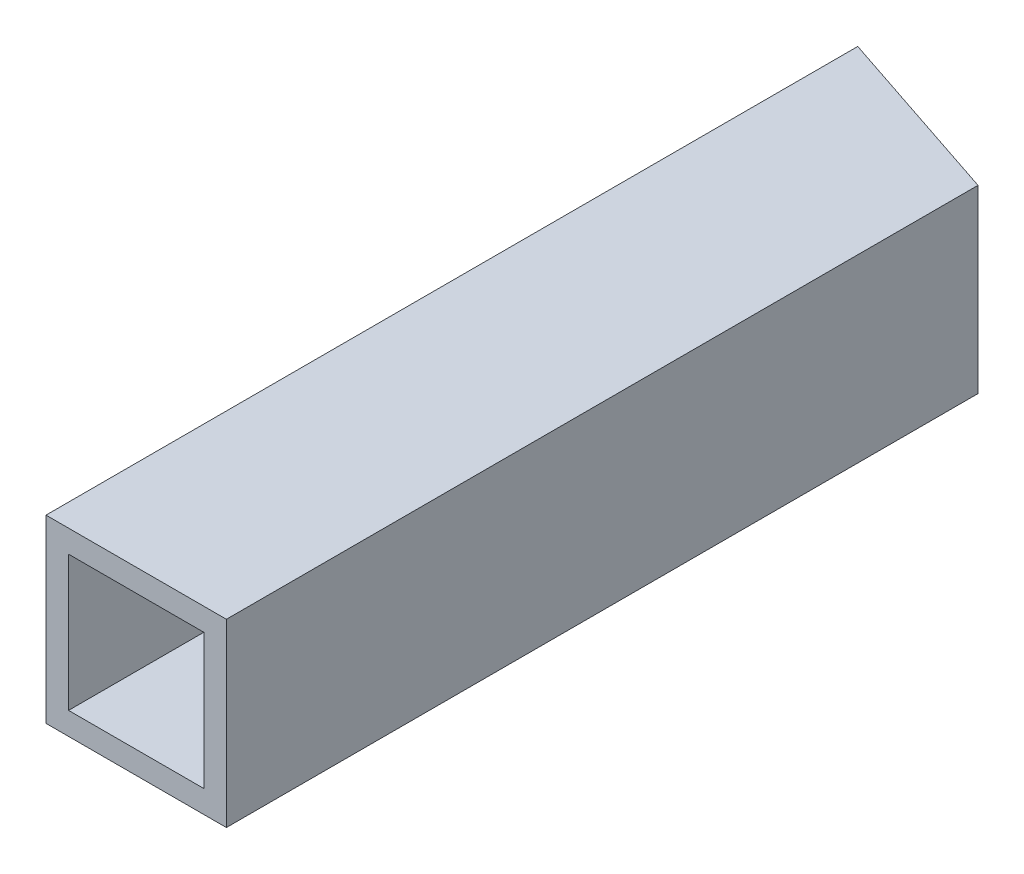
ISO-10303-21;
HEADER;
FILE_DESCRIPTION(('STEP AP214'),'2;1');
FILE_NAME('part.step','',(''),(''),'','','');
FILE_SCHEMA(('AUTOMOTIVE_DESIGN { 1 0 10303 214 1 1 1 1 }'));
ENDSEC;
DATA;
#1=APPLICATION_CONTEXT('core data for automotive mechanical design processes');
#2=APPLICATION_PROTOCOL_DEFINITION('international standard','automotive_design',2000,#1);
#3=PRODUCT_CONTEXT('',#1,'mechanical');
#4=PRODUCT('Part','Part','',(#3));
#5=PRODUCT_RELATED_PRODUCT_CATEGORY('part','',(#4));
#6=PRODUCT_DEFINITION_FORMATION('','',#4);
#7=PRODUCT_DEFINITION_CONTEXT('part definition',#1,'design');
#8=PRODUCT_DEFINITION('design','',#6,#7);
#9=PRODUCT_DEFINITION_SHAPE('','',#8);
#10=(LENGTH_UNIT() NAMED_UNIT(*) SI_UNIT(.MILLI.,.METRE.));
#11=(NAMED_UNIT(*) PLANE_ANGLE_UNIT() SI_UNIT($,.RADIAN.));
#12=(NAMED_UNIT(*) SI_UNIT($,.STERADIAN.) SOLID_ANGLE_UNIT());
#13=UNCERTAINTY_MEASURE_WITH_UNIT(LENGTH_MEASURE(1.E-05),#10,'distance_accuracy_value','');
#14=(GEOMETRIC_REPRESENTATION_CONTEXT(3) GLOBAL_UNCERTAINTY_ASSIGNED_CONTEXT((#13)) GLOBAL_UNIT_ASSIGNED_CONTEXT((#10,
#11,#12)) REPRESENTATION_CONTEXT('',''));
#15=CARTESIAN_POINT('',(0.,0.,0.));
#16=DIRECTION('',(0.,0.,1.));
#17=DIRECTION('',(1.,0.,0.));
#18=AXIS2_PLACEMENT_3D('',#15,#16,#17);
#19=CARTESIAN_POINT('',(0.,0.,114.3));
#20=DIRECTION('',(0.,0.,-1.));
#21=DIRECTION('',(-1.,0.,0.));
#22=AXIS2_PLACEMENT_3D('',#19,#20,#21);
#23=PLANE('',#22);
#24=DIRECTION('',(0.,-1.,0.));
#25=VECTOR('',#24,1.);
#26=CARTESIAN_POINT('',(0.,0.,114.3));
#27=LINE('',#26,#25);
#28=CARTESIAN_POINT('',(0.,25.4,114.3));
#29=VERTEX_POINT('',#28);
#30=CARTESIAN_POINT('',(0.,0.,114.3));
#31=VERTEX_POINT('',#30);
#32=EDGE_CURVE('E142',#29,#31,#27,.T.);
#33=ORIENTED_EDGE('',*,*,#32,.T.);
#34=DIRECTION('',(1.,0.,0.));
#35=VECTOR('',#34,1.);
#36=CARTESIAN_POINT('',(0.,0.,114.3));
#37=LINE('',#36,#35);
#38=CARTESIAN_POINT('',(25.4,0.,114.3));
#39=VERTEX_POINT('',#38);
#40=EDGE_CURVE('E148',#31,#39,#37,.T.);
#41=ORIENTED_EDGE('',*,*,#40,.T.);
#42=DIRECTION('',(0.,1.,0.));
#43=VECTOR('',#42,1.);
#44=CARTESIAN_POINT('',(25.4,0.,114.3));
#45=LINE('',#44,#43);
#46=CARTESIAN_POINT('',(25.4,25.4,114.3));
#47=VERTEX_POINT('',#46);
#48=EDGE_CURVE('E126',#39,#47,#45,.T.);
#49=ORIENTED_EDGE('',*,*,#48,.T.);
#50=DIRECTION('',(-1.,0.,0.));
#51=VECTOR('',#50,1.);
#52=CARTESIAN_POINT('',(0.,25.4,114.3));
#53=LINE('',#52,#51);
#54=EDGE_CURVE('E138',#47,#29,#53,.T.);
#55=ORIENTED_EDGE('',*,*,#54,.T.);
#56=EDGE_LOOP('',(#33,#41,#49,#55));
#57=FACE_BOUND('',#56,.T.);
#58=DIRECTION('',(0.,-1.,0.));
#59=VECTOR('',#58,1.);
#60=CARTESIAN_POINT('',(3.175,22.225,114.3));
#61=LINE('',#60,#59);
#62=CARTESIAN_POINT('',(3.175,22.225,114.3));
#63=VERTEX_POINT('',#62);
#64=CARTESIAN_POINT('',(3.175,3.175,114.3));
#65=VERTEX_POINT('',#64);
#66=EDGE_CURVE('E176',#63,#65,#61,.T.);
#67=ORIENTED_EDGE('',*,*,#66,.F.);
#68=DIRECTION('',(-1.,0.,0.));
#69=VECTOR('',#68,1.);
#70=CARTESIAN_POINT('',(3.175,22.225,114.3));
#71=LINE('',#70,#69);
#72=CARTESIAN_POINT('',(22.225,22.225,114.3));
#73=VERTEX_POINT('',#72);
#74=EDGE_CURVE('E167',#73,#63,#71,.T.);
#75=ORIENTED_EDGE('',*,*,#74,.F.);
#76=DIRECTION('',(0.,1.,0.));
#77=VECTOR('',#76,1.);
#78=CARTESIAN_POINT('',(22.225,22.225,114.3));
#79=LINE('',#78,#77);
#80=CARTESIAN_POINT('',(22.225,3.175,114.3));
#81=VERTEX_POINT('',#80);
#82=EDGE_CURVE('E170',#81,#73,#79,.T.);
#83=ORIENTED_EDGE('',*,*,#82,.F.);
#84=DIRECTION('',(1.,0.,0.));
#85=VECTOR('',#84,1.);
#86=CARTESIAN_POINT('',(3.175,3.175,114.3));
#87=LINE('',#86,#85);
#88=EDGE_CURVE('E173',#65,#81,#87,.T.);
#89=ORIENTED_EDGE('',*,*,#88,.F.);
#90=EDGE_LOOP('',(#67,#75,#83,#89));
#91=FACE_BOUND('',#90,.T.);
#92=ADVANCED_FACE('F39',(#57,#91),#23,.F.);
#93=CARTESIAN_POINT('',(0.,0.,114.3));
#94=DIRECTION('',(1.,0.,0.));
#95=DIRECTION('',(0.,1.,0.));
#96=AXIS2_PLACEMENT_3D('',#93,#94,#95);
#97=PLANE('',#96);
#98=DIRECTION('',(0.,-1.,0.));
#99=VECTOR('',#98,1.);
#100=CARTESIAN_POINT('',(0.,0.,0.));
#101=LINE('',#100,#99);
#102=CARTESIAN_POINT('',(0.,25.4,0.));
#103=VERTEX_POINT('',#102);
#104=CARTESIAN_POINT('',(0.,0.,0.));
#105=VERTEX_POINT('',#104);
#106=EDGE_CURVE('E139',#103,#105,#101,.T.);
#107=ORIENTED_EDGE('',*,*,#106,.T.);
#108=DIRECTION('',(0.,0.,-1.));
#109=VECTOR('',#108,1.);
#110=CARTESIAN_POINT('',(0.,0.,114.3));
#111=LINE('',#110,#109);
#112=EDGE_CURVE('E48',#31,#105,#111,.T.);
#113=ORIENTED_EDGE('',*,*,#112,.F.);
#114=ORIENTED_EDGE('',*,*,#32,.F.);
#115=DIRECTION('',(0.,0.,-1.));
#116=VECTOR('',#115,1.);
#117=CARTESIAN_POINT('',(0.,25.4,114.3));
#118=LINE('',#117,#116);
#119=EDGE_CURVE('E132',#29,#103,#118,.T.);
#120=ORIENTED_EDGE('',*,*,#119,.T.);
#121=EDGE_LOOP('',(#107,#113,#114,#120));
#122=FACE_BOUND('',#121,.T.);
#123=ADVANCED_FACE('F41',(#122),#97,.F.);
#124=CARTESIAN_POINT('',(0.,0.,114.3));
#125=DIRECTION('',(0.,1.,0.));
#126=DIRECTION('',(0.,0.,1.));
#127=AXIS2_PLACEMENT_3D('',#124,#125,#126);
#128=PLANE('',#127);
#129=ORIENTED_EDGE('',*,*,#112,.T.);
#130=DIRECTION('',(0.94865541582806,0.,0.316311400395388));
#131=VECTOR('',#130,1.);
#132=CARTESIAN_POINT('',(0.,0.,0.));
#133=LINE('',#132,#131);
#134=CARTESIAN_POINT('',(25.4,0.,8.4691548016198));
#135=VERTEX_POINT('',#134);
#136=EDGE_CURVE('E106',#105,#135,#133,.T.);
#137=ORIENTED_EDGE('',*,*,#136,.T.);
#138=DIRECTION('',(0.,0.,-1.));
#139=VECTOR('',#138,1.);
#140=CARTESIAN_POINT('',(25.4,0.,114.3));
#141=LINE('',#140,#139);
#142=EDGE_CURVE('E119',#39,#135,#141,.T.);
#143=ORIENTED_EDGE('',*,*,#142,.F.);
#144=ORIENTED_EDGE('',*,*,#40,.F.);
#145=EDGE_LOOP('',(#129,#137,#143,#144));
#146=FACE_BOUND('',#145,.T.);
#147=ADVANCED_FACE('F118',(#146),#128,.F.);
#148=CARTESIAN_POINT('',(25.4,0.,114.3));
#149=DIRECTION('',(-1.,0.,0.));
#150=DIRECTION('',(0.,-1.,0.));
#151=AXIS2_PLACEMENT_3D('',#148,#149,#150);
#152=PLANE('',#151);
#153=ORIENTED_EDGE('',*,*,#142,.T.);
#154=DIRECTION('',(0.,1.,0.));
#155=VECTOR('',#154,1.);
#156=CARTESIAN_POINT('',(25.4,0.,8.4691548016198));
#157=LINE('',#156,#155);
#158=CARTESIAN_POINT('',(25.4,25.4,8.4691548016198));
#159=VERTEX_POINT('',#158);
#160=EDGE_CURVE('E103',#135,#159,#157,.T.);
#161=ORIENTED_EDGE('',*,*,#160,.T.);
#162=DIRECTION('',(0.,0.,-1.));
#163=VECTOR('',#162,1.);
#164=CARTESIAN_POINT('',(25.4,25.4,114.3));
#165=LINE('',#164,#163);
#166=EDGE_CURVE('E128',#47,#159,#165,.T.);
#167=ORIENTED_EDGE('',*,*,#166,.F.);
#168=ORIENTED_EDGE('',*,*,#48,.F.);
#169=EDGE_LOOP('',(#153,#161,#167,#168));
#170=FACE_BOUND('',#169,.T.);
#171=ADVANCED_FACE('F125',(#170),#152,.F.);
#172=CARTESIAN_POINT('',(0.,25.4,114.3));
#173=DIRECTION('',(0.,-1.,0.));
#174=DIRECTION('',(0.,0.,-1.));
#175=AXIS2_PLACEMENT_3D('',#172,#173,#174);
#176=PLANE('',#175);
#177=ORIENTED_EDGE('',*,*,#166,.T.);
#178=DIRECTION('',(0.94865541582806,0.,0.316311400395388));
#179=VECTOR('',#178,1.);
#180=CARTESIAN_POINT('',(0.,25.4,0.));
#181=LINE('',#180,#179);
#182=EDGE_CURVE('E109',#103,#159,#181,.T.);
#183=ORIENTED_EDGE('',*,*,#182,.F.);
#184=ORIENTED_EDGE('',*,*,#119,.F.);
#185=ORIENTED_EDGE('',*,*,#54,.F.);
#186=EDGE_LOOP('',(#177,#183,#184,#185));
#187=FACE_BOUND('',#186,.T.);
#188=ADVANCED_FACE('F206',(#187),#176,.F.);
#189=CARTESIAN_POINT('',(3.175,22.225,114.3));
#190=DIRECTION('',(1.,0.,0.));
#191=DIRECTION('',(0.,1.,0.));
#192=AXIS2_PLACEMENT_3D('',#189,#190,#191);
#193=PLANE('',#192);
#194=DIRECTION('',(0.,-1.,0.));
#195=VECTOR('',#194,1.);
#196=CARTESIAN_POINT('',(3.175,22.225,1.05864435020246));
#197=LINE('',#196,#195);
#198=CARTESIAN_POINT('',(3.175,22.225,1.05864435020246));
#199=VERTEX_POINT('',#198);
#200=CARTESIAN_POINT('',(3.175,3.175,1.05864435020246));
#201=VERTEX_POINT('',#200);
#202=EDGE_CURVE('E179',#199,#201,#197,.T.);
#203=ORIENTED_EDGE('',*,*,#202,.F.);
#204=DIRECTION('',(0.,0.,-1.));
#205=VECTOR('',#204,1.);
#206=CARTESIAN_POINT('',(3.175,22.225,114.3));
#207=LINE('',#206,#205);
#208=EDGE_CURVE('E163',#63,#199,#207,.T.);
#209=ORIENTED_EDGE('',*,*,#208,.F.);
#210=ORIENTED_EDGE('',*,*,#66,.T.);
#211=DIRECTION('',(0.,0.,-1.));
#212=VECTOR('',#211,1.);
#213=CARTESIAN_POINT('',(3.175,3.175,114.3));
#214=LINE('',#213,#212);
#215=EDGE_CURVE('E143',#65,#201,#214,.T.);
#216=ORIENTED_EDGE('',*,*,#215,.T.);
#217=EDGE_LOOP('',(#203,#209,#210,#216));
#218=FACE_BOUND('',#217,.T.);
#219=ADVANCED_FACE('F204',(#218),#193,.T.);
#220=CARTESIAN_POINT('',(3.175,3.175,114.3));
#221=DIRECTION('',(0.,1.,0.));
#222=DIRECTION('',(0.,0.,1.));
#223=AXIS2_PLACEMENT_3D('',#220,#221,#222);
#224=PLANE('',#223);
#225=DIRECTION('',(0.94865541582806,0.,0.316311400395388));
#226=VECTOR('',#225,1.);
#227=CARTESIAN_POINT('',(37.1553928233578,3.175,12.388770611654));
#228=LINE('',#227,#226);
#229=CARTESIAN_POINT('',(22.225,3.175,7.41051045141732));
#230=VERTEX_POINT('',#229);
#231=EDGE_CURVE('E182',#201,#230,#228,.T.);
#232=ORIENTED_EDGE('',*,*,#231,.F.);
#233=ORIENTED_EDGE('',*,*,#215,.F.);
#234=ORIENTED_EDGE('',*,*,#88,.T.);
#235=DIRECTION('',(0.,0.,-1.));
#236=VECTOR('',#235,1.);
#237=CARTESIAN_POINT('',(22.225,3.175,114.3));
#238=LINE('',#237,#236);
#239=EDGE_CURVE('E157',#81,#230,#238,.T.);
#240=ORIENTED_EDGE('',*,*,#239,.T.);
#241=EDGE_LOOP('',(#232,#233,#234,#240));
#242=FACE_BOUND('',#241,.T.);
#243=ADVANCED_FACE('F196',(#242),#224,.T.);
#244=CARTESIAN_POINT('',(22.225,22.225,114.3));
#245=DIRECTION('',(-1.,0.,0.));
#246=DIRECTION('',(0.,-1.,0.));
#247=AXIS2_PLACEMENT_3D('',#244,#245,#246);
#248=PLANE('',#247);
#249=DIRECTION('',(0.,1.,0.));
#250=VECTOR('',#249,1.);
#251=CARTESIAN_POINT('',(22.225,22.225,7.41051045141732));
#252=LINE('',#251,#250);
#253=CARTESIAN_POINT('',(22.225,22.225,7.41051045141733));
#254=VERTEX_POINT('',#253);
#255=EDGE_CURVE('E54',#230,#254,#252,.T.);
#256=ORIENTED_EDGE('',*,*,#255,.F.);
#257=ORIENTED_EDGE('',*,*,#239,.F.);
#258=ORIENTED_EDGE('',*,*,#82,.T.);
#259=DIRECTION('',(0.,0.,-1.));
#260=VECTOR('',#259,1.);
#261=CARTESIAN_POINT('',(22.225,22.225,114.3));
#262=LINE('',#261,#260);
#263=EDGE_CURVE('E61',#73,#254,#262,.T.);
#264=ORIENTED_EDGE('',*,*,#263,.T.);
#265=EDGE_LOOP('',(#256,#257,#258,#264));
#266=FACE_BOUND('',#265,.T.);
#267=ADVANCED_FACE('F194',(#266),#248,.T.);
#268=CARTESIAN_POINT('',(3.175,22.225,114.3));
#269=DIRECTION('',(0.,-1.,0.));
#270=DIRECTION('',(0.,0.,-1.));
#271=AXIS2_PLACEMENT_3D('',#268,#269,#270);
#272=PLANE('',#271);
#273=DIRECTION('',(-0.94865541582806,0.,-0.316311400395388));
#274=VECTOR('',#273,1.);
#275=CARTESIAN_POINT('',(37.1553928233578,22.225,12.388770611654));
#276=LINE('',#275,#274);
#277=EDGE_CURVE('E11',#254,#199,#276,.T.);
#278=ORIENTED_EDGE('',*,*,#277,.F.);
#279=ORIENTED_EDGE('',*,*,#263,.F.);
#280=ORIENTED_EDGE('',*,*,#74,.T.);
#281=ORIENTED_EDGE('',*,*,#208,.T.);
#282=EDGE_LOOP('',(#278,#279,#280,#281));
#283=FACE_BOUND('',#282,.T.);
#284=ADVANCED_FACE('F202',(#283),#272,.T.);
#285=CARTESIAN_POINT('',(0.,0.,0.));
#286=DIRECTION('',(-0.316311400395388,0.,0.94865541582806));
#287=DIRECTION('',(0.94865541582806,0.,0.316311400395388));
#288=AXIS2_PLACEMENT_3D('',#285,#286,#287);
#289=PLANE('',#288);
#290=ORIENTED_EDGE('',*,*,#202,.T.);
#291=ORIENTED_EDGE('',*,*,#231,.T.);
#292=ORIENTED_EDGE('',*,*,#255,.T.);
#293=ORIENTED_EDGE('',*,*,#277,.T.);
#294=EDGE_LOOP('',(#290,#291,#292,#293));
#295=FACE_BOUND('',#294,.T.);
#296=ORIENTED_EDGE('',*,*,#182,.T.);
#297=ORIENTED_EDGE('',*,*,#160,.F.);
#298=ORIENTED_EDGE('',*,*,#136,.F.);
#299=ORIENTED_EDGE('',*,*,#106,.F.);
#300=EDGE_LOOP('',(#296,#297,#298,#299));
#301=FACE_BOUND('',#300,.T.);
#302=ADVANCED_FACE('F105',(#295,#301),#289,.F.);
#303=CLOSED_SHELL('',(#92,#123,#147,#171,#188,#219,#243,#267,#284,#302));
#304=MANIFOLD_SOLID_BREP('B2',#303);
#305=ADVANCED_BREP_SHAPE_REPRESENTATION('',(#18,#304),#14);
#306=SHAPE_DEFINITION_REPRESENTATION(#9,#305);
ENDSEC;
END-ISO-10303-21;
